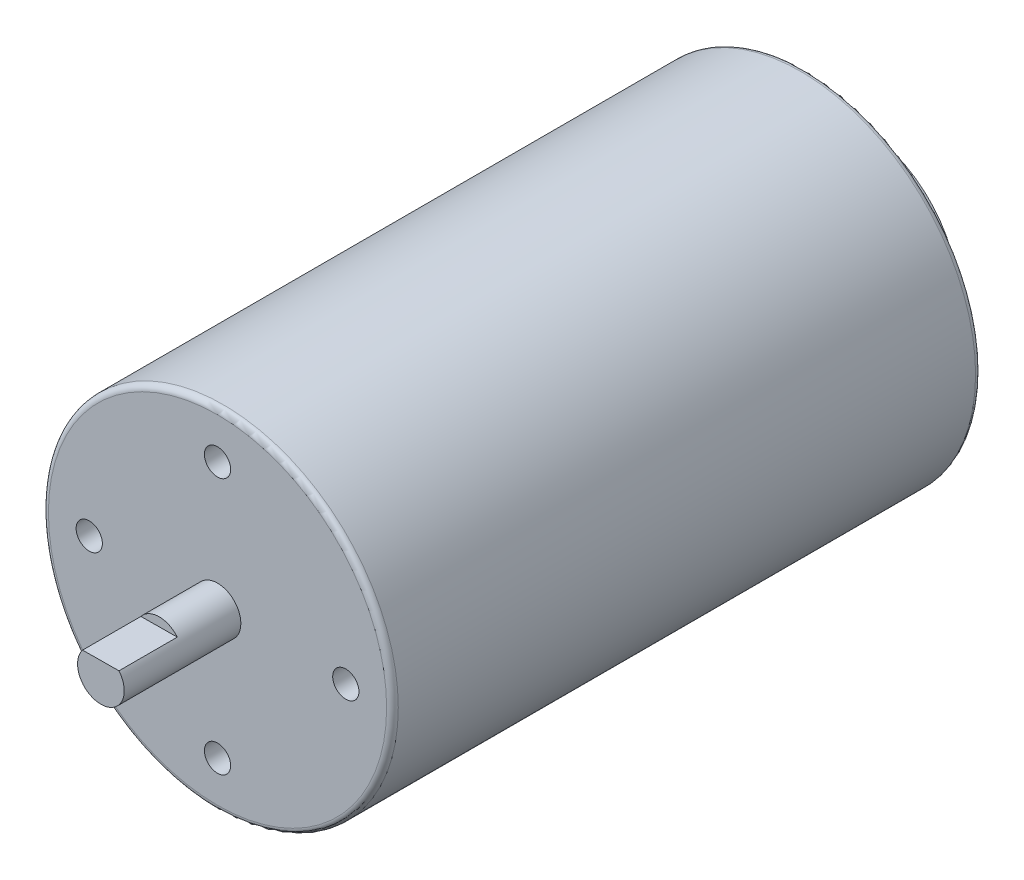
ISO-10303-21;
HEADER;
FILE_DESCRIPTION(('STEP AP214'),'2;1');
FILE_NAME('part.step','',(''),(''),'','','');
FILE_SCHEMA(('AUTOMOTIVE_DESIGN { 1 0 10303 214 1 1 1 1 }'));
ENDSEC;
DATA;
#1=APPLICATION_CONTEXT('core data for automotive mechanical design processes');
#2=APPLICATION_PROTOCOL_DEFINITION('international standard','automotive_design',2000,#1);
#3=PRODUCT_CONTEXT('',#1,'mechanical');
#4=PRODUCT('Part','Part','',(#3));
#5=PRODUCT_RELATED_PRODUCT_CATEGORY('part','',(#4));
#6=PRODUCT_DEFINITION_FORMATION('','',#4);
#7=PRODUCT_DEFINITION_CONTEXT('part definition',#1,'design');
#8=PRODUCT_DEFINITION('design','',#6,#7);
#9=PRODUCT_DEFINITION_SHAPE('','',#8);
#10=(LENGTH_UNIT() NAMED_UNIT(*) SI_UNIT(.MILLI.,.METRE.));
#11=(NAMED_UNIT(*) PLANE_ANGLE_UNIT() SI_UNIT($,.RADIAN.));
#12=(NAMED_UNIT(*) SI_UNIT($,.STERADIAN.) SOLID_ANGLE_UNIT());
#13=UNCERTAINTY_MEASURE_WITH_UNIT(LENGTH_MEASURE(1.E-05),#10,'distance_accuracy_value','');
#14=(GEOMETRIC_REPRESENTATION_CONTEXT(3) GLOBAL_UNCERTAINTY_ASSIGNED_CONTEXT((#13)) GLOBAL_UNIT_ASSIGNED_CONTEXT((#10,
#11,#12)) REPRESENTATION_CONTEXT('',''));
#15=CARTESIAN_POINT('',(0.,0.,0.));
#16=DIRECTION('',(0.,0.,1.));
#17=DIRECTION('',(1.,0.,0.));
#18=AXIS2_PLACEMENT_3D('',#15,#16,#17);
#19=CARTESIAN_POINT('',(0.,0.,101.));
#20=DIRECTION('',(0.,0.,-1.));
#21=DIRECTION('',(-1.,0.,0.));
#22=AXIS2_PLACEMENT_3D('',#19,#20,#21);
#23=CYLINDRICAL_SURFACE('',#22,30.);
#24=CARTESIAN_POINT('',(0.,0.,1.));
#25=DIRECTION('',(0.,0.,1.));
#26=DIRECTION('',(1.,0.,0.));
#27=AXIS2_PLACEMENT_3D('',#24,#25,#26);
#28=CIRCLE('',#27,30.);
#29=CARTESIAN_POINT('',(30.,0.,1.));
#30=VERTEX_POINT('',#29);
#31=EDGE_CURVE('E85',#30,#30,#28,.T.);
#32=ORIENTED_EDGE('',*,*,#31,.T.);
#33=EDGE_LOOP('',(#32));
#34=FACE_BOUND('',#33,.T.);
#35=CARTESIAN_POINT('',(0.,0.,100.));
#36=DIRECTION('',(0.,0.,1.));
#37=DIRECTION('',(1.,0.,0.));
#38=AXIS2_PLACEMENT_3D('',#35,#36,#37);
#39=CIRCLE('',#38,30.);
#40=CARTESIAN_POINT('',(30.,0.,100.));
#41=VERTEX_POINT('',#40);
#42=EDGE_CURVE('E82',#41,#41,#39,.F.);
#43=ORIENTED_EDGE('',*,*,#42,.T.);
#44=EDGE_LOOP('',(#43));
#45=FACE_BOUND('',#44,.T.);
#46=ADVANCED_FACE('F40',(#34,#45),#23,.T.);
#47=CARTESIAN_POINT('',(0.,0.,101.));
#48=DIRECTION('',(0.,0.,1.));
#49=DIRECTION('',(1.,0.,0.));
#50=AXIS2_PLACEMENT_3D('',#47,#48,#49);
#51=PLANE('',#50);
#52=CARTESIAN_POINT('',(0.,22.,101.));
#53=DIRECTION('',(0.,0.,1.));
#54=DIRECTION('',(1.,0.,0.));
#55=AXIS2_PLACEMENT_3D('',#52,#53,#54);
#56=CIRCLE('',#55,2.25);
#57=CARTESIAN_POINT('',(2.25,22.,101.));
#58=VERTEX_POINT('',#57);
#59=EDGE_CURVE('E201',#58,#58,#56,.T.);
#60=ORIENTED_EDGE('',*,*,#59,.F.);
#61=EDGE_LOOP('',(#60));
#62=FACE_BOUND('',#61,.T.);
#63=CARTESIAN_POINT('',(22.,0.,101.));
#64=DIRECTION('',(0.,0.,1.));
#65=DIRECTION('',(1.,0.,0.));
#66=AXIS2_PLACEMENT_3D('',#63,#64,#65);
#67=CIRCLE('',#66,2.25);
#68=CARTESIAN_POINT('',(24.25,0.,101.));
#69=VERTEX_POINT('',#68);
#70=EDGE_CURVE('E204',#69,#69,#67,.T.);
#71=ORIENTED_EDGE('',*,*,#70,.F.);
#72=EDGE_LOOP('',(#71));
#73=FACE_BOUND('',#72,.T.);
#74=CARTESIAN_POINT('',(-1.53625178909098E-13,-22.,101.));
#75=DIRECTION('',(0.,0.,1.));
#76=DIRECTION('',(1.,0.,0.));
#77=AXIS2_PLACEMENT_3D('',#74,#75,#76);
#78=CIRCLE('',#77,2.25);
#79=CARTESIAN_POINT('',(2.24999999999985,-22.,101.));
#80=VERTEX_POINT('',#79);
#81=EDGE_CURVE('E210',#80,#80,#78,.T.);
#82=ORIENTED_EDGE('',*,*,#81,.F.);
#83=EDGE_LOOP('',(#82));
#84=FACE_BOUND('',#83,.T.);
#85=CARTESIAN_POINT('',(-22.,2.30437768363647E-13,101.));
#86=DIRECTION('',(0.,0.,1.));
#87=DIRECTION('',(1.,0.,0.));
#88=AXIS2_PLACEMENT_3D('',#85,#86,#87);
#89=CIRCLE('',#88,2.25);
#90=CARTESIAN_POINT('',(-19.75,2.30437768363647E-13,101.));
#91=VERTEX_POINT('',#90);
#92=EDGE_CURVE('E216',#91,#91,#89,.T.);
#93=ORIENTED_EDGE('',*,*,#92,.F.);
#94=EDGE_LOOP('',(#93));
#95=FACE_BOUND('',#94,.T.);
#96=CARTESIAN_POINT('',(0.,0.,101.));
#97=DIRECTION('',(0.,0.,1.));
#98=DIRECTION('',(1.,0.,0.));
#99=AXIS2_PLACEMENT_3D('',#96,#97,#98);
#100=CIRCLE('',#99,29.);
#101=CARTESIAN_POINT('',(29.,0.,101.));
#102=VERTEX_POINT('',#101);
#103=EDGE_CURVE('E48',#102,#102,#100,.T.);
#104=ORIENTED_EDGE('',*,*,#103,.T.);
#105=EDGE_LOOP('',(#104));
#106=FACE_BOUND('',#105,.T.);
#107=CARTESIAN_POINT('',(0.,0.,101.));
#108=DIRECTION('',(0.,0.,1.));
#109=DIRECTION('',(1.,0.,0.));
#110=AXIS2_PLACEMENT_3D('',#107,#108,#109);
#111=CIRCLE('',#110,4.);
#112=CARTESIAN_POINT('',(4.,0.,101.));
#113=VERTEX_POINT('',#112);
#114=EDGE_CURVE('E79',#113,#113,#111,.T.);
#115=ORIENTED_EDGE('',*,*,#114,.F.);
#116=EDGE_LOOP('',(#115));
#117=FACE_BOUND('',#116,.T.);
#118=ADVANCED_FACE('F98',(#62,#73,#84,#95,#106,#117),#51,.T.);
#119=CARTESIAN_POINT('',(0.,0.,0.));
#120=DIRECTION('',(0.,0.,1.));
#121=DIRECTION('',(1.,0.,0.));
#122=AXIS2_PLACEMENT_3D('',#119,#120,#121);
#123=PLANE('',#122);
#124=CARTESIAN_POINT('',(0.,0.,0.));
#125=DIRECTION('',(0.,0.,1.));
#126=DIRECTION('',(1.,0.,0.));
#127=AXIS2_PLACEMENT_3D('',#124,#125,#126);
#128=CIRCLE('',#127,17.);
#129=CARTESIAN_POINT('',(17.,0.,0.));
#130=VERTEX_POINT('',#129);
#131=EDGE_CURVE('E11',#130,#130,#128,.F.);
#132=ORIENTED_EDGE('',*,*,#131,.F.);
#133=EDGE_LOOP('',(#132));
#134=FACE_BOUND('',#133,.T.);
#135=CARTESIAN_POINT('',(0.,0.,0.));
#136=DIRECTION('',(0.,0.,1.));
#137=DIRECTION('',(1.,0.,0.));
#138=AXIS2_PLACEMENT_3D('',#135,#136,#137);
#139=CIRCLE('',#138,29.);
#140=CARTESIAN_POINT('',(29.,0.,0.));
#141=VERTEX_POINT('',#140);
#142=EDGE_CURVE('E93',#141,#141,#139,.F.);
#143=ORIENTED_EDGE('',*,*,#142,.T.);
#144=EDGE_LOOP('',(#143));
#145=FACE_BOUND('',#144,.T.);
#146=ADVANCED_FACE('F123',(#134,#145),#123,.F.);
#147=CARTESIAN_POINT('',(0.,0.,121.));
#148=DIRECTION('',(0.,0.,-1.));
#149=DIRECTION('',(-1.,0.,0.));
#150=AXIS2_PLACEMENT_3D('',#147,#148,#149);
#151=CYLINDRICAL_SURFACE('',#150,4.);
#152=CARTESIAN_POINT('',(0.,0.,121.));
#153=DIRECTION('',(0.,0.,1.));
#154=DIRECTION('',(1.,0.,0.));
#155=AXIS2_PLACEMENT_3D('',#152,#153,#154);
#156=CIRCLE('',#155,4.);
#157=CARTESIAN_POINT('',(-3.14267715093951,2.4745868998608,121.));
#158=VERTEX_POINT('',#157);
#159=CARTESIAN_POINT('',(3.10198141091228,2.5254131001392,121.));
#160=VERTEX_POINT('',#159);
#161=EDGE_CURVE('E78',#158,#160,#156,.T.);
#162=ORIENTED_EDGE('',*,*,#161,.F.);
#163=DIRECTION('',(0.,0.,1.));
#164=VECTOR('',#163,1.);
#165=CARTESIAN_POINT('',(-3.14267715093951,2.4745868998608,111.));
#166=LINE('',#165,#164);
#167=CARTESIAN_POINT('',(-3.14267715093951,2.4745868998608,111.));
#168=VERTEX_POINT('',#167);
#169=EDGE_CURVE('E55',#168,#158,#166,.T.);
#170=ORIENTED_EDGE('',*,*,#169,.F.);
#171=CARTESIAN_POINT('',(0.,0.,111.));
#172=DIRECTION('',(0.,0.,1.));
#173=DIRECTION('',(-1.,0.,0.));
#174=AXIS2_PLACEMENT_3D('',#171,#172,#173);
#175=CIRCLE('',#174,4.);
#176=CARTESIAN_POINT('',(3.10198141091228,2.5254131001392,111.));
#177=VERTEX_POINT('',#176);
#178=EDGE_CURVE('E71',#177,#168,#175,.T.);
#179=ORIENTED_EDGE('',*,*,#178,.F.);
#180=DIRECTION('',(0.,0.,1.));
#181=VECTOR('',#180,1.);
#182=CARTESIAN_POINT('',(3.10198141091228,2.5254131001392,111.));
#183=LINE('',#182,#181);
#184=EDGE_CURVE('E61',#177,#160,#183,.T.);
#185=ORIENTED_EDGE('',*,*,#184,.T.);
#186=EDGE_LOOP('',(#162,#170,#179,#185));
#187=FACE_BOUND('',#186,.T.);
#188=ORIENTED_EDGE('',*,*,#114,.T.);
#189=EDGE_LOOP('',(#188));
#190=FACE_BOUND('',#189,.T.);
#191=ADVANCED_FACE('F76',(#187,#190),#151,.T.);
#192=CARTESIAN_POINT('',(0.,0.,121.));
#193=DIRECTION('',(0.,0.,1.));
#194=DIRECTION('',(1.,0.,0.));
#195=AXIS2_PLACEMENT_3D('',#192,#193,#194);
#196=PLANE('',#195);
#197=DIRECTION('',(0.999966878780468,0.00813887842693932,0.));
#198=VECTOR('',#197,1.);
#199=CARTESIAN_POINT('',(-3.14267715093951,2.4745868998608,121.));
#200=LINE('',#199,#198);
#201=EDGE_CURVE('E66',#158,#160,#200,.T.);
#202=ORIENTED_EDGE('',*,*,#201,.F.);
#203=ORIENTED_EDGE('',*,*,#161,.T.);
#204=EDGE_LOOP('',(#202,#203));
#205=FACE_BOUND('',#204,.T.);
#206=ADVANCED_FACE('F81',(#205),#196,.T.);
#207=CARTESIAN_POINT('',(-3.14267715093951,2.4745868998608,111.));
#208=DIRECTION('',(0.00813887842693933,-0.999966878780468,0.));
#209=DIRECTION('',(0.999966878780468,0.00813887842693933,0.));
#210=AXIS2_PLACEMENT_3D('',#207,#208,#209);
#211=PLANE('',#210);
#212=ORIENTED_EDGE('',*,*,#201,.T.);
#213=ORIENTED_EDGE('',*,*,#184,.F.);
#214=DIRECTION('',(0.999966878780468,0.00813887842693932,0.));
#215=VECTOR('',#214,1.);
#216=CARTESIAN_POINT('',(-3.14267715093951,2.4745868998608,111.));
#217=LINE('',#216,#215);
#218=EDGE_CURVE('E224',#168,#177,#217,.T.);
#219=ORIENTED_EDGE('',*,*,#218,.F.);
#220=ORIENTED_EDGE('',*,*,#169,.T.);
#221=EDGE_LOOP('',(#212,#213,#219,#220));
#222=FACE_BOUND('',#221,.T.);
#223=ADVANCED_FACE('F67',(#222),#211,.F.);
#224=CARTESIAN_POINT('',(0.,0.,111.));
#225=DIRECTION('',(0.,0.,-1.));
#226=DIRECTION('',(-1.,0.,0.));
#227=AXIS2_PLACEMENT_3D('',#224,#225,#226);
#228=PLANE('',#227);
#229=ORIENTED_EDGE('',*,*,#178,.T.);
#230=ORIENTED_EDGE('',*,*,#218,.T.);
#231=EDGE_LOOP('',(#229,#230));
#232=FACE_BOUND('',#231,.T.);
#233=ADVANCED_FACE('F113',(#232),#228,.F.);
#234=CARTESIAN_POINT('',(0.,0.,1.));
#235=DIRECTION('',(0.,0.,1.));
#236=DIRECTION('',(1.,0.,0.));
#237=AXIS2_PLACEMENT_3D('',#234,#235,#236);
#238=TOROIDAL_SURFACE('',#237,29.,1.);
#239=ORIENTED_EDGE('',*,*,#142,.F.);
#240=EDGE_LOOP('',(#239));
#241=FACE_BOUND('',#240,.T.);
#242=ORIENTED_EDGE('',*,*,#31,.F.);
#243=EDGE_LOOP('',(#242));
#244=FACE_BOUND('',#243,.T.);
#245=ADVANCED_FACE('F103',(#241,#244),#238,.T.);
#246=CARTESIAN_POINT('',(0.,0.,100.));
#247=DIRECTION('',(0.,0.,1.));
#248=DIRECTION('',(1.,0.,0.));
#249=AXIS2_PLACEMENT_3D('',#246,#247,#248);
#250=TOROIDAL_SURFACE('',#249,29.,1.);
#251=ORIENTED_EDGE('',*,*,#42,.F.);
#252=EDGE_LOOP('',(#251));
#253=FACE_BOUND('',#252,.T.);
#254=ORIENTED_EDGE('',*,*,#103,.F.);
#255=EDGE_LOOP('',(#254));
#256=FACE_BOUND('',#255,.T.);
#257=ADVANCED_FACE('F42',(#253,#256),#250,.T.);
#258=CARTESIAN_POINT('',(0.,0.,-9.));
#259=DIRECTION('',(0.,0.,1.));
#260=DIRECTION('',(1.,0.,0.));
#261=AXIS2_PLACEMENT_3D('',#258,#259,#260);
#262=CYLINDRICAL_SURFACE('',#261,17.);
#263=CARTESIAN_POINT('',(0.,0.,-9.));
#264=DIRECTION('',(0.,0.,-1.));
#265=DIRECTION('',(-1.,0.,0.));
#266=AXIS2_PLACEMENT_3D('',#263,#264,#265);
#267=CIRCLE('',#266,17.);
#268=CARTESIAN_POINT('',(-17.,0.,-9.));
#269=VERTEX_POINT('',#268);
#270=EDGE_CURVE('E72',#269,#269,#267,.T.);
#271=ORIENTED_EDGE('',*,*,#270,.F.);
#272=EDGE_LOOP('',(#271));
#273=FACE_BOUND('',#272,.T.);
#274=ORIENTED_EDGE('',*,*,#131,.T.);
#275=EDGE_LOOP('',(#274));
#276=FACE_BOUND('',#275,.T.);
#277=ADVANCED_FACE('F102',(#273,#276),#262,.T.);
#278=CARTESIAN_POINT('',(0.,0.,-9.));
#279=DIRECTION('',(0.,0.,-1.));
#280=DIRECTION('',(-1.,0.,0.));
#281=AXIS2_PLACEMENT_3D('',#278,#279,#280);
#282=PLANE('',#281);
#283=ORIENTED_EDGE('',*,*,#270,.T.);
#284=EDGE_LOOP('',(#283));
#285=FACE_BOUND('',#284,.T.);
#286=ADVANCED_FACE('F110',(#285),#282,.T.);
#287=CARTESIAN_POINT('',(-22.,2.30437768363647E-13,92.));
#288=DIRECTION('',(0.,0.,1.));
#289=DIRECTION('',(1.,0.,0.));
#290=AXIS2_PLACEMENT_3D('',#287,#288,#289);
#291=CYLINDRICAL_SURFACE('',#290,2.25);
#292=CARTESIAN_POINT('',(-22.,2.30437768363647E-13,92.));
#293=DIRECTION('',(0.,0.,1.));
#294=DIRECTION('',(1.,0.,0.));
#295=AXIS2_PLACEMENT_3D('',#292,#293,#294);
#296=CIRCLE('',#295,2.25);
#297=CARTESIAN_POINT('',(-19.75,2.30437768363647E-13,92.));
#298=VERTEX_POINT('',#297);
#299=EDGE_CURVE('E195',#298,#298,#296,.T.);
#300=ORIENTED_EDGE('',*,*,#299,.F.);
#301=EDGE_LOOP('',(#300));
#302=FACE_BOUND('',#301,.T.);
#303=ORIENTED_EDGE('',*,*,#92,.T.);
#304=EDGE_LOOP('',(#303));
#305=FACE_BOUND('',#304,.T.);
#306=ADVANCED_FACE('F140',(#302,#305),#291,.F.);
#307=CARTESIAN_POINT('',(-22.,2.30437768363647E-13,92.));
#308=DIRECTION('',(0.,0.,1.));
#309=DIRECTION('',(1.,0.,0.));
#310=AXIS2_PLACEMENT_3D('',#307,#308,#309);
#311=PLANE('',#310);
#312=ORIENTED_EDGE('',*,*,#299,.T.);
#313=EDGE_LOOP('',(#312));
#314=FACE_BOUND('',#313,.T.);
#315=ADVANCED_FACE('F142',(#314),#311,.T.);
#316=CARTESIAN_POINT('',(-1.53625178909098E-13,-22.,92.));
#317=DIRECTION('',(0.,0.,1.));
#318=DIRECTION('',(1.,0.,0.));
#319=AXIS2_PLACEMENT_3D('',#316,#317,#318);
#320=CYLINDRICAL_SURFACE('',#319,2.25);
#321=CARTESIAN_POINT('',(-1.53625178909098E-13,-22.,92.));
#322=DIRECTION('',(0.,0.,1.));
#323=DIRECTION('',(1.,0.,0.));
#324=AXIS2_PLACEMENT_3D('',#321,#322,#323);
#325=CIRCLE('',#324,2.25);
#326=CARTESIAN_POINT('',(2.24999999999985,-22.,92.));
#327=VERTEX_POINT('',#326);
#328=EDGE_CURVE('E213',#327,#327,#325,.T.);
#329=ORIENTED_EDGE('',*,*,#328,.F.);
#330=EDGE_LOOP('',(#329));
#331=FACE_BOUND('',#330,.T.);
#332=ORIENTED_EDGE('',*,*,#81,.T.);
#333=EDGE_LOOP('',(#332));
#334=FACE_BOUND('',#333,.T.);
#335=ADVANCED_FACE('F145',(#331,#334),#320,.F.);
#336=CARTESIAN_POINT('',(-1.53625178909098E-13,-22.,92.));
#337=DIRECTION('',(0.,0.,1.));
#338=DIRECTION('',(1.,0.,0.));
#339=AXIS2_PLACEMENT_3D('',#336,#337,#338);
#340=PLANE('',#339);
#341=ORIENTED_EDGE('',*,*,#328,.T.);
#342=EDGE_LOOP('',(#341));
#343=FACE_BOUND('',#342,.T.);
#344=ADVANCED_FACE('F150',(#343),#340,.T.);
#345=CARTESIAN_POINT('',(22.,0.,92.));
#346=DIRECTION('',(0.,0.,1.));
#347=DIRECTION('',(1.,0.,0.));
#348=AXIS2_PLACEMENT_3D('',#345,#346,#347);
#349=CYLINDRICAL_SURFACE('',#348,2.25);
#350=CARTESIAN_POINT('',(22.,0.,92.));
#351=DIRECTION('',(0.,0.,1.));
#352=DIRECTION('',(1.,0.,0.));
#353=AXIS2_PLACEMENT_3D('',#350,#351,#352);
#354=CIRCLE('',#353,2.25);
#355=CARTESIAN_POINT('',(24.25,0.,92.));
#356=VERTEX_POINT('',#355);
#357=EDGE_CURVE('E207',#356,#356,#354,.T.);
#358=ORIENTED_EDGE('',*,*,#357,.F.);
#359=EDGE_LOOP('',(#358));
#360=FACE_BOUND('',#359,.T.);
#361=ORIENTED_EDGE('',*,*,#70,.T.);
#362=EDGE_LOOP('',(#361));
#363=FACE_BOUND('',#362,.T.);
#364=ADVANCED_FACE('F153',(#360,#363),#349,.F.);
#365=CARTESIAN_POINT('',(22.,0.,92.));
#366=DIRECTION('',(0.,0.,1.));
#367=DIRECTION('',(1.,0.,0.));
#368=AXIS2_PLACEMENT_3D('',#365,#366,#367);
#369=PLANE('',#368);
#370=ORIENTED_EDGE('',*,*,#357,.T.);
#371=EDGE_LOOP('',(#370));
#372=FACE_BOUND('',#371,.T.);
#373=ADVANCED_FACE('F158',(#372),#369,.T.);
#374=CARTESIAN_POINT('',(0.,22.,92.));
#375=DIRECTION('',(0.,0.,1.));
#376=DIRECTION('',(1.,0.,0.));
#377=AXIS2_PLACEMENT_3D('',#374,#375,#376);
#378=CYLINDRICAL_SURFACE('',#377,2.25);
#379=CARTESIAN_POINT('',(0.,22.,92.));
#380=DIRECTION('',(0.,0.,1.));
#381=DIRECTION('',(1.,0.,0.));
#382=AXIS2_PLACEMENT_3D('',#379,#380,#381);
#383=CIRCLE('',#382,2.25);
#384=CARTESIAN_POINT('',(2.25,22.,92.));
#385=VERTEX_POINT('',#384);
#386=EDGE_CURVE('E198',#385,#385,#383,.T.);
#387=ORIENTED_EDGE('',*,*,#386,.F.);
#388=EDGE_LOOP('',(#387));
#389=FACE_BOUND('',#388,.T.);
#390=ORIENTED_EDGE('',*,*,#59,.T.);
#391=EDGE_LOOP('',(#390));
#392=FACE_BOUND('',#391,.T.);
#393=ADVANCED_FACE('F161',(#389,#392),#378,.F.);
#394=CARTESIAN_POINT('',(0.,22.,92.));
#395=DIRECTION('',(0.,0.,1.));
#396=DIRECTION('',(1.,0.,0.));
#397=AXIS2_PLACEMENT_3D('',#394,#395,#396);
#398=PLANE('',#397);
#399=ORIENTED_EDGE('',*,*,#386,.T.);
#400=EDGE_LOOP('',(#399));
#401=FACE_BOUND('',#400,.T.);
#402=ADVANCED_FACE('F168',(#401),#398,.T.);
#403=CLOSED_SHELL('',(#46,#118,#146,#191,#206,#223,#233,#245,#257,#277,#286,#306,#315,#335,#344,
#364,#373,#393,#402));
#404=CARTESIAN_POINT('',(0.,0.,90.));
#405=DIRECTION('',(0.,0.,1.));
#406=DIRECTION('',(0.,-1.,0.));
#407=AXIS2_PLACEMENT_3D('',#404,#405,#406);
#408=CYLINDRICAL_SURFACE('',#407,20.);
#409=CARTESIAN_POINT('',(0.,0.,11.));
#410=DIRECTION('',(0.,0.,1.));
#411=DIRECTION('',(0.,-1.,0.));
#412=AXIS2_PLACEMENT_3D('',#409,#410,#411);
#413=CIRCLE('',#412,20.);
#414=CARTESIAN_POINT('',(0.,-20.,11.));
#415=VERTEX_POINT('',#414);
#416=EDGE_CURVE('E192',#415,#415,#413,.T.);
#417=ORIENTED_EDGE('',*,*,#416,.F.);
#418=EDGE_LOOP('',(#417));
#419=FACE_BOUND('',#418,.T.);
#420=CARTESIAN_POINT('',(0.,0.,90.));
#421=DIRECTION('',(0.,0.,1.));
#422=DIRECTION('',(0.,-1.,0.));
#423=AXIS2_PLACEMENT_3D('',#420,#421,#422);
#424=CIRCLE('',#423,20.);
#425=CARTESIAN_POINT('',(0.,-20.,90.));
#426=VERTEX_POINT('',#425);
#427=EDGE_CURVE('E190',#426,#426,#424,.T.);
#428=ORIENTED_EDGE('',*,*,#427,.T.);
#429=EDGE_LOOP('',(#428));
#430=FACE_BOUND('',#429,.T.);
#431=ADVANCED_FACE('F173',(#419,#430),#408,.F.);
#432=CARTESIAN_POINT('',(0.,-20.,11.));
#433=DIRECTION('',(0.,0.,-1.));
#434=DIRECTION('',(0.,1.,0.));
#435=AXIS2_PLACEMENT_3D('',#432,#433,#434);
#436=PLANE('',#435);
#437=ORIENTED_EDGE('',*,*,#416,.T.);
#438=EDGE_LOOP('',(#437));
#439=FACE_BOUND('',#438,.T.);
#440=ADVANCED_FACE('F176',(#439),#436,.F.);
#441=CARTESIAN_POINT('',(0.,-20.,90.));
#442=DIRECTION('',(0.,0.,1.));
#443=DIRECTION('',(0.,-1.,0.));
#444=AXIS2_PLACEMENT_3D('',#441,#442,#443);
#445=PLANE('',#444);
#446=ORIENTED_EDGE('',*,*,#427,.F.);
#447=EDGE_LOOP('',(#446));
#448=FACE_BOUND('',#447,.T.);
#449=ADVANCED_FACE('F181',(#448),#445,.F.);
#450=CLOSED_SHELL('',(#431,#440,#449));
#451=ORIENTED_CLOSED_SHELL('',*,#450,.T.);
#452=BREP_WITH_VOIDS('B2',#403,(#451));
#453=ADVANCED_BREP_SHAPE_REPRESENTATION('',(#18,#452),#14);
#454=SHAPE_DEFINITION_REPRESENTATION(#9,#453);
ENDSEC;
END-ISO-10303-21;
